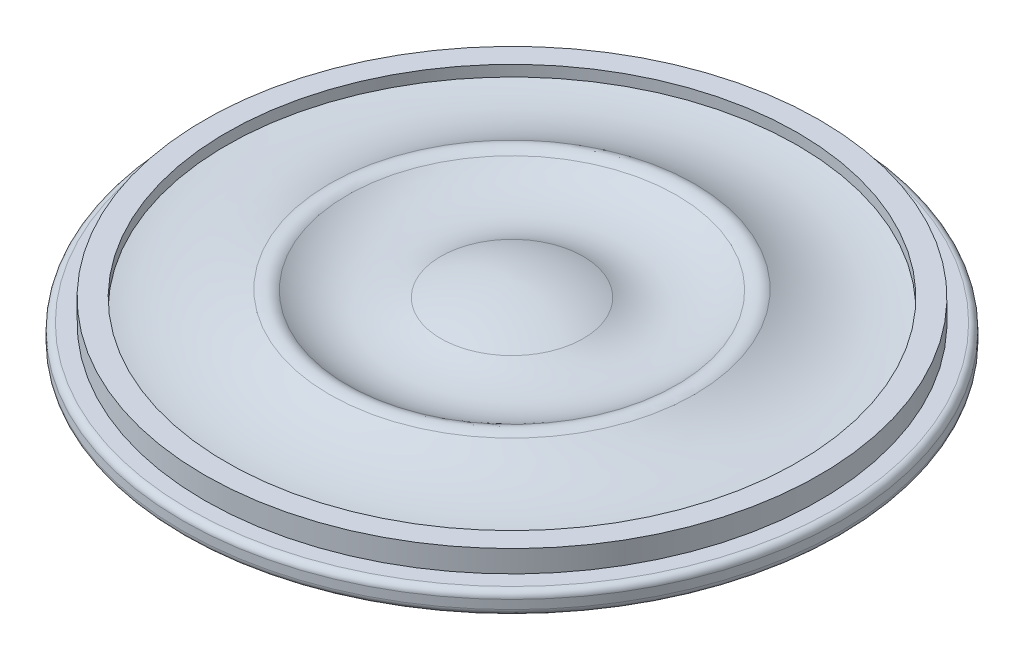
ISO-10303-21;
HEADER;
FILE_DESCRIPTION(('STEP AP214'),'2;1');
FILE_NAME('part.step','',(''),(''),'','','');
FILE_SCHEMA(('AUTOMOTIVE_DESIGN { 1 0 10303 214 1 1 1 1 }'));
ENDSEC;
DATA;
#1=APPLICATION_CONTEXT('core data for automotive mechanical design processes');
#2=APPLICATION_PROTOCOL_DEFINITION('international standard','automotive_design',2000,#1);
#3=PRODUCT_CONTEXT('',#1,'mechanical');
#4=PRODUCT('Part','Part','',(#3));
#5=PRODUCT_RELATED_PRODUCT_CATEGORY('part','',(#4));
#6=PRODUCT_DEFINITION_FORMATION('','',#4);
#7=PRODUCT_DEFINITION_CONTEXT('part definition',#1,'design');
#8=PRODUCT_DEFINITION('design','',#6,#7);
#9=PRODUCT_DEFINITION_SHAPE('','',#8);
#10=(LENGTH_UNIT() NAMED_UNIT(*) SI_UNIT(.MILLI.,.METRE.));
#11=(NAMED_UNIT(*) PLANE_ANGLE_UNIT() SI_UNIT($,.RADIAN.));
#12=(NAMED_UNIT(*) SI_UNIT($,.STERADIAN.) SOLID_ANGLE_UNIT());
#13=UNCERTAINTY_MEASURE_WITH_UNIT(LENGTH_MEASURE(1.E-05),#10,'distance_accuracy_value','');
#14=(GEOMETRIC_REPRESENTATION_CONTEXT(3) GLOBAL_UNCERTAINTY_ASSIGNED_CONTEXT((#13)) GLOBAL_UNIT_ASSIGNED_CONTEXT((#10,
#11,#12)) REPRESENTATION_CONTEXT('',''));
#15=CARTESIAN_POINT('',(0.,0.,0.));
#16=DIRECTION('',(0.,0.,1.));
#17=DIRECTION('',(1.,0.,0.));
#18=AXIS2_PLACEMENT_3D('',#15,#16,#17);
#19=CARTESIAN_POINT('',(0.,-4.37173358637806,0.261175007442525));
#20=DIRECTION('',(-1.,0.,0.));
#21=DIRECTION('',(0.,0.,-1.));
#22=AXIS2_PLACEMENT_3D('',#19,#20,#21);
#23=CIRCLE('',#22,9.07549241896727);
#24=TRIMMED_CURVE('',#23,(PARAMETER_VALUE(-1.5420142994785)),(PARAMETER_VALUE(1.5420142994785)),
.T.,.PARAMETER.);
#25=CARTESIAN_POINT('',(0.,-4.37173358637806,0.));
#26=DIRECTION('',(0.,-1.,0.));
#27=AXIS1_PLACEMENT('',#25,#26);
#28=SURFACE_OF_REVOLUTION('',#24,#27);
#29=CARTESIAN_POINT('',(0.,4.7,0.));
#30=VERTEX_POINT('',#29);
#31=VERTEX_LOOP('',#30);
#32=FACE_BOUND('',#31,.T.);
#33=CARTESIAN_POINT('',(0.,4.,0.));
#34=DIRECTION('',(0.,-1.,0.));
#35=DIRECTION('',(0.,0.,-1.));
#36=AXIS2_PLACEMENT_3D('',#33,#34,#35);
#37=CIRCLE('',#36,3.24291394768431);
#38=CARTESIAN_POINT('',(0.,4.,-3.24291394768431));
#39=VERTEX_POINT('',#38);
#40=EDGE_CURVE('E49',#39,#39,#37,.T.);
#41=ORIENTED_EDGE('',*,*,#40,.F.);
#42=EDGE_LOOP('',(#41));
#43=FACE_BOUND('',#42,.T.);
#44=ADVANCED_FACE('F35',(#32,#43),#28,.T.);
#45=CARTESIAN_POINT('',(0.,7.58416322124248,0.));
#46=DIRECTION('',(0.,-1.,0.));
#47=DIRECTION('',(0.,0.,-1.));
#48=AXIS2_PLACEMENT_3D('',#45,#46,#47);
#49=TOROIDAL_SURFACE('',#48,5.13123959711297,4.05117263947088);
#50=ORIENTED_EDGE('',*,*,#40,.T.);
#51=EDGE_LOOP('',(#50));
#52=FACE_BOUND('',#51,.T.);
#53=CARTESIAN_POINT('',(0.,4.2914001779998,0.));
#54=DIRECTION('',(0.,-1.,0.));
#55=DIRECTION('',(0.,0.,-1.));
#56=AXIS2_PLACEMENT_3D('',#53,#54,#55);
#57=CIRCLE('',#56,7.49126317662496);
#58=CARTESIAN_POINT('',(0.,4.2914001779998,-7.49126317662496));
#59=VERTEX_POINT('',#58);
#60=EDGE_CURVE('E52',#59,#59,#57,.T.);
#61=ORIENTED_EDGE('',*,*,#60,.F.);
#62=EDGE_LOOP('',(#61));
#63=FACE_BOUND('',#62,.T.);
#64=ADVANCED_FACE('F46',(#52,#63),#49,.F.);
#65=CARTESIAN_POINT('',(0.,3.67936782145066,0.));
#66=DIRECTION('',(0.,-1.,0.));
#67=DIRECTION('',(0.,0.,-1.));
#68=AXIS2_PLACEMENT_3D('',#65,#66,#67);
#69=TOROIDAL_SURFACE('',#68,7.9299254107157,0.752999442948378);
#70=ORIENTED_EDGE('',*,*,#60,.T.);
#71=EDGE_LOOP('',(#70));
#72=FACE_BOUND('',#71,.T.);
#73=CARTESIAN_POINT('',(0.,4.32927439203146,0.));
#74=DIRECTION('',(0.,-1.,0.));
#75=DIRECTION('',(0.,0.,-1.));
#76=AXIS2_PLACEMENT_3D('',#73,#74,#75);
#77=CIRCLE('',#76,8.31022740991697);
#78=CARTESIAN_POINT('',(0.,4.32927439203146,-8.31022740991697));
#79=VERTEX_POINT('',#78);
#80=EDGE_CURVE('E58',#79,#79,#77,.T.);
#81=ORIENTED_EDGE('',*,*,#80,.F.);
#82=EDGE_LOOP('',(#81));
#83=FACE_BOUND('',#82,.T.);
#84=ADVANCED_FACE('F238',(#72,#83),#69,.T.);
#85=CARTESIAN_POINT('',(0.,10.2513418570426,0.));
#86=DIRECTION('',(0.,-1.,0.));
#87=DIRECTION('',(0.,0.,-1.));
#88=AXIS2_PLACEMENT_3D('',#85,#86,#87);
#89=TOROIDAL_SURFACE('',#88,11.7756087405532,6.86146856196731);
#90=ORIENTED_EDGE('',*,*,#80,.T.);
#91=EDGE_LOOP('',(#90));
#92=FACE_BOUND('',#91,.T.);
#93=CARTESIAN_POINT('',(0.,3.5,0.));
#94=DIRECTION('',(0.,-1.,0.));
#95=DIRECTION('',(0.,0.,-1.));
#96=AXIS2_PLACEMENT_3D('',#93,#94,#95);
#97=CIRCLE('',#96,13.);
#98=CARTESIAN_POINT('',(0.,3.5,-13.));
#99=VERTEX_POINT('',#98);
#100=EDGE_CURVE('E250',#99,#99,#97,.T.);
#101=ORIENTED_EDGE('',*,*,#100,.F.);
#102=EDGE_LOOP('',(#101));
#103=FACE_BOUND('',#102,.T.);
#104=ADVANCED_FACE('F234',(#92,#103),#89,.F.);
#105=CARTESIAN_POINT('',(0.,0.,0.));
#106=DIRECTION('',(0.,-1.,0.));
#107=DIRECTION('',(0.,0.,-1.));
#108=AXIS2_PLACEMENT_3D('',#105,#106,#107);
#109=CYLINDRICAL_SURFACE('',#108,13.);
#110=ORIENTED_EDGE('',*,*,#100,.T.);
#111=EDGE_LOOP('',(#110));
#112=FACE_BOUND('',#111,.T.);
#113=CARTESIAN_POINT('',(0.,4.,0.));
#114=DIRECTION('',(0.,-1.,0.));
#115=DIRECTION('',(0.,0.,-1.));
#116=AXIS2_PLACEMENT_3D('',#113,#114,#115);
#117=CIRCLE('',#116,13.);
#118=CARTESIAN_POINT('',(0.,4.,-13.));
#119=VERTEX_POINT('',#118);
#120=EDGE_CURVE('E252',#119,#119,#117,.T.);
#121=ORIENTED_EDGE('',*,*,#120,.F.);
#122=EDGE_LOOP('',(#121));
#123=FACE_BOUND('',#122,.T.);
#124=ADVANCED_FACE('F230',(#112,#123),#109,.F.);
#125=CARTESIAN_POINT('',(14.,4.,0.));
#126=DIRECTION('',(0.,1.,0.));
#127=DIRECTION('',(0.,0.,1.));
#128=AXIS2_PLACEMENT_3D('',#125,#126,#127);
#129=PLANE('',#128);
#130=ORIENTED_EDGE('',*,*,#120,.T.);
#131=EDGE_LOOP('',(#130));
#132=FACE_BOUND('',#131,.T.);
#133=CARTESIAN_POINT('',(0.,4.,0.));
#134=DIRECTION('',(0.,-1.,0.));
#135=DIRECTION('',(0.,0.,-1.));
#136=AXIS2_PLACEMENT_3D('',#133,#134,#135);
#137=CIRCLE('',#136,14.);
#138=CARTESIAN_POINT('',(0.,4.,-14.));
#139=VERTEX_POINT('',#138);
#140=EDGE_CURVE('E257',#139,#139,#137,.T.);
#141=ORIENTED_EDGE('',*,*,#140,.F.);
#142=EDGE_LOOP('',(#141));
#143=FACE_BOUND('',#142,.T.);
#144=ADVANCED_FACE('F226',(#132,#143),#129,.T.);
#145=CARTESIAN_POINT('',(0.,0.,0.));
#146=DIRECTION('',(0.,-1.,0.));
#147=DIRECTION('',(0.,0.,-1.));
#148=AXIS2_PLACEMENT_3D('',#145,#146,#147);
#149=CYLINDRICAL_SURFACE('',#148,14.);
#150=ORIENTED_EDGE('',*,*,#140,.T.);
#151=EDGE_LOOP('',(#150));
#152=FACE_BOUND('',#151,.T.);
#153=CARTESIAN_POINT('',(0.,3.,0.));
#154=DIRECTION('',(0.,-1.,0.));
#155=DIRECTION('',(0.,0.,-1.));
#156=AXIS2_PLACEMENT_3D('',#153,#154,#155);
#157=CIRCLE('',#156,14.);
#158=CARTESIAN_POINT('',(0.,3.,-14.));
#159=VERTEX_POINT('',#158);
#160=EDGE_CURVE('E260',#159,#159,#157,.T.);
#161=ORIENTED_EDGE('',*,*,#160,.F.);
#162=EDGE_LOOP('',(#161));
#163=FACE_BOUND('',#162,.T.);
#164=ADVANCED_FACE('F222',(#152,#163),#149,.T.);
#165=CARTESIAN_POINT('',(15.,3.,0.));
#166=DIRECTION('',(0.,1.,0.));
#167=DIRECTION('',(0.,0.,1.));
#168=AXIS2_PLACEMENT_3D('',#165,#166,#167);
#169=PLANE('',#168);
#170=CARTESIAN_POINT('',(0.,3.,0.));
#171=DIRECTION('',(0.,1.,0.));
#172=DIRECTION('',(0.,0.,1.));
#173=AXIS2_PLACEMENT_3D('',#170,#171,#172);
#174=CIRCLE('',#173,14.7);
#175=CARTESIAN_POINT('',(0.,3.,14.7));
#176=VERTEX_POINT('',#175);
#177=EDGE_CURVE('E70',#176,#176,#174,.T.);
#178=ORIENTED_EDGE('',*,*,#177,.T.);
#179=EDGE_LOOP('',(#178));
#180=FACE_BOUND('',#179,.T.);
#181=ORIENTED_EDGE('',*,*,#160,.T.);
#182=EDGE_LOOP('',(#181));
#183=FACE_BOUND('',#182,.T.);
#184=ADVANCED_FACE('F218',(#180,#183),#169,.T.);
#185=CARTESIAN_POINT('',(0.,0.,0.));
#186=DIRECTION('',(0.,-1.,0.));
#187=DIRECTION('',(0.,0.,-1.));
#188=AXIS2_PLACEMENT_3D('',#185,#186,#187);
#189=CYLINDRICAL_SURFACE('',#188,15.);
#190=CARTESIAN_POINT('',(0.,2.7,0.));
#191=DIRECTION('',(0.,1.,0.));
#192=DIRECTION('',(0.,0.,1.));
#193=AXIS2_PLACEMENT_3D('',#190,#191,#192);
#194=CIRCLE('',#193,15.);
#195=CARTESIAN_POINT('',(0.,2.7,15.));
#196=VERTEX_POINT('',#195);
#197=EDGE_CURVE('E67',#196,#196,#194,.F.);
#198=ORIENTED_EDGE('',*,*,#197,.T.);
#199=EDGE_LOOP('',(#198));
#200=FACE_BOUND('',#199,.T.);
#201=CARTESIAN_POINT('',(0.,2.3,0.));
#202=DIRECTION('',(0.,-1.,0.));
#203=DIRECTION('',(0.,0.,-1.));
#204=AXIS2_PLACEMENT_3D('',#201,#202,#203);
#205=CIRCLE('',#204,15.);
#206=CARTESIAN_POINT('',(0.,2.3,-15.));
#207=VERTEX_POINT('',#206);
#208=EDGE_CURVE('E64',#207,#207,#205,.F.);
#209=ORIENTED_EDGE('',*,*,#208,.T.);
#210=EDGE_LOOP('',(#209));
#211=FACE_BOUND('',#210,.T.);
#212=ADVANCED_FACE('F214',(#200,#211),#189,.T.);
#213=CARTESIAN_POINT('',(13.,2.,0.));
#214=DIRECTION('',(0.,-1.,0.));
#215=DIRECTION('',(0.,0.,-1.));
#216=AXIS2_PLACEMENT_3D('',#213,#214,#215);
#217=PLANE('',#216);
#218=CARTESIAN_POINT('',(0.,2.,0.));
#219=DIRECTION('',(0.,-1.,0.));
#220=DIRECTION('',(0.,0.,-1.));
#221=AXIS2_PLACEMENT_3D('',#218,#219,#220);
#222=CIRCLE('',#221,14.7);
#223=CARTESIAN_POINT('',(0.,2.,-14.7));
#224=VERTEX_POINT('',#223);
#225=EDGE_CURVE('E73',#224,#224,#222,.T.);
#226=ORIENTED_EDGE('',*,*,#225,.T.);
#227=EDGE_LOOP('',(#226));
#228=FACE_BOUND('',#227,.T.);
#229=CARTESIAN_POINT('',(0.,2.,0.));
#230=DIRECTION('',(0.,-1.,0.));
#231=DIRECTION('',(0.,0.,-1.));
#232=AXIS2_PLACEMENT_3D('',#229,#230,#231);
#233=CIRCLE('',#232,13.);
#234=CARTESIAN_POINT('',(0.,2.,-13.));
#235=VERTEX_POINT('',#234);
#236=EDGE_CURVE('E263',#235,#235,#233,.T.);
#237=ORIENTED_EDGE('',*,*,#236,.F.);
#238=EDGE_LOOP('',(#237));
#239=FACE_BOUND('',#238,.T.);
#240=ADVANCED_FACE('F210',(#228,#239),#217,.T.);
#241=CARTESIAN_POINT('',(0.,0.,0.));
#242=DIRECTION('',(0.,-1.,0.));
#243=DIRECTION('',(0.,0.,-1.));
#244=AXIS2_PLACEMENT_3D('',#241,#242,#243);
#245=CYLINDRICAL_SURFACE('',#244,13.);
#246=CARTESIAN_POINT('',(0.,1.8,0.));
#247=DIRECTION('',(0.,-1.,0.));
#248=DIRECTION('',(0.,0.,-1.));
#249=AXIS2_PLACEMENT_3D('',#246,#247,#248);
#250=CIRCLE('',#249,13.);
#251=CARTESIAN_POINT('',(0.,1.8,-13.));
#252=VERTEX_POINT('',#251);
#253=EDGE_CURVE('E11',#252,#252,#250,.F.);
#254=ORIENTED_EDGE('',*,*,#253,.T.);
#255=EDGE_LOOP('',(#254));
#256=FACE_BOUND('',#255,.T.);
#257=ORIENTED_EDGE('',*,*,#236,.T.);
#258=EDGE_LOOP('',(#257));
#259=FACE_BOUND('',#258,.T.);
#260=ADVANCED_FACE('F207',(#256,#259),#245,.T.);
#261=CARTESIAN_POINT('',(8.,1.5,0.));
#262=DIRECTION('',(0.,-1.,0.));
#263=DIRECTION('',(0.,0.,-1.));
#264=AXIS2_PLACEMENT_3D('',#261,#262,#263);
#265=PLANE('',#264);
#266=CARTESIAN_POINT('',(0.,1.5,0.));
#267=DIRECTION('',(0.,-1.,0.));
#268=DIRECTION('',(0.,0.,-1.));
#269=AXIS2_PLACEMENT_3D('',#266,#267,#268);
#270=CIRCLE('',#269,12.7);
#271=CARTESIAN_POINT('',(0.,1.5,-12.7));
#272=VERTEX_POINT('',#271);
#273=EDGE_CURVE('E41',#272,#272,#270,.T.);
#274=ORIENTED_EDGE('',*,*,#273,.T.);
#275=EDGE_LOOP('',(#274));
#276=FACE_BOUND('',#275,.T.);
#277=CARTESIAN_POINT('',(-9.00896263988139,1.5,5.75057930904377));
#278=DIRECTION('',(0.,-1.,0.));
#279=DIRECTION('',(0.499999999999989,0.,-0.866025403784445));
#280=AXIS2_PLACEMENT_3D('',#277,#278,#279);
#281=CIRCLE('',#280,1.26698993207958);
#282=CARTESIAN_POINT('',(-8.37546767384162,1.5,4.65333384152372));
#283=VERTEX_POINT('',#282);
#284=EDGE_CURVE('E338',#283,#283,#281,.T.);
#285=ORIENTED_EDGE('',*,*,#284,.F.);
#286=EDGE_LOOP('',(#285));
#287=FACE_BOUND('',#286,.T.);
#288=CARTESIAN_POINT('',(-10.6772801624041,1.5,0.475666448168358));
#289=DIRECTION('',(0.,-1.,0.));
#290=DIRECTION('',(0.866025403784433,0.,-0.50000000000001));
#291=AXIS2_PLACEMENT_3D('',#288,#289,#290);
#292=CIRCLE('',#291,1.26698993207958);
#293=CARTESIAN_POINT('',(-9.58003469488406,1.5,-0.157828517871444));
#294=VERTEX_POINT('',#293);
#295=EDGE_CURVE('E332',#294,#294,#292,.T.);
#296=ORIENTED_EDGE('',*,*,#295,.F.);
#297=EDGE_LOOP('',(#296));
#298=FACE_BOUND('',#297,.T.);
#299=CARTESIAN_POINT('',(-9.48462908804975,1.5,-4.92670085336034));
#300=DIRECTION('',(0.,-1.,0.));
#301=DIRECTION('',(1.,0.,0.));
#302=AXIS2_PLACEMENT_3D('',#299,#300,#301);
#303=CIRCLE('',#302,1.26698993207958);
#304=CARTESIAN_POINT('',(-8.21763915597018,1.5,-4.92670085336036));
#305=VERTEX_POINT('',#304);
#306=EDGE_CURVE('E326',#305,#305,#303,.T.);
#307=ORIENTED_EDGE('',*,*,#306,.F.);
#308=EDGE_LOOP('',(#307));
#309=FACE_BOUND('',#308,.T.);
#310=CARTESIAN_POINT('',(-5.75057930904374,1.5,-9.00896263988141));
#311=DIRECTION('',(0.,-1.,0.));
#312=DIRECTION('',(0.866025403784443,0.,0.499999999999992));
#313=AXIS2_PLACEMENT_3D('',#310,#311,#312);
#314=CIRCLE('',#313,1.26698993207958);
#315=CARTESIAN_POINT('',(-4.6533338415237,1.5,-8.37546767384164));
#316=VERTEX_POINT('',#315);
#317=EDGE_CURVE('E320',#316,#316,#314,.T.);
#318=ORIENTED_EDGE('',*,*,#317,.F.);
#319=EDGE_LOOP('',(#318));
#320=FACE_BOUND('',#319,.T.);
#321=CARTESIAN_POINT('',(-0.475666448168321,1.5,-10.6772801624041));
#322=DIRECTION('',(0.,-1.,0.));
#323=DIRECTION('',(0.500000000000007,0.,0.866025403784435));
#324=AXIS2_PLACEMENT_3D('',#321,#322,#323);
#325=CIRCLE('',#324,1.26698993207958);
#326=CARTESIAN_POINT('',(0.157828517871476,1.5,-9.58003469488406));
#327=VERTEX_POINT('',#326);
#328=EDGE_CURVE('E314',#327,#327,#325,.T.);
#329=ORIENTED_EDGE('',*,*,#328,.F.);
#330=EDGE_LOOP('',(#329));
#331=FACE_BOUND('',#330,.T.);
#332=CARTESIAN_POINT('',(4.92670085336038,1.5,-9.48462908804974));
#333=DIRECTION('',(0.,-1.,0.));
#334=DIRECTION('',(0.,0.,1.));
#335=AXIS2_PLACEMENT_3D('',#332,#333,#334);
#336=CIRCLE('',#335,1.26698993207958);
#337=CARTESIAN_POINT('',(4.92670085336039,1.5,-8.21763915597016));
#338=VERTEX_POINT('',#337);
#339=EDGE_CURVE('E308',#338,#338,#336,.T.);
#340=ORIENTED_EDGE('',*,*,#339,.F.);
#341=EDGE_LOOP('',(#340));
#342=FACE_BOUND('',#341,.T.);
#343=CARTESIAN_POINT('',(9.00896263988144,1.5,-5.7505793090437));
#344=DIRECTION('',(0.,-1.,0.));
#345=DIRECTION('',(-0.499999999999995,0.,0.866025403784442));
#346=AXIS2_PLACEMENT_3D('',#343,#344,#345);
#347=CIRCLE('',#346,1.26698993207958);
#348=CARTESIAN_POINT('',(8.37546767384165,1.5,-4.65333384152367));
#349=VERTEX_POINT('',#348);
#350=EDGE_CURVE('E302',#349,#349,#347,.T.);
#351=ORIENTED_EDGE('',*,*,#350,.F.);
#352=EDGE_LOOP('',(#351));
#353=FACE_BOUND('',#352,.T.);
#354=CARTESIAN_POINT('',(10.6772801624041,1.5,-0.475666448168283));
#355=DIRECTION('',(0.,-1.,0.));
#356=DIRECTION('',(-0.866025403784436,0.,0.500000000000004));
#357=AXIS2_PLACEMENT_3D('',#354,#355,#356);
#358=CIRCLE('',#357,1.26698993207958);
#359=CARTESIAN_POINT('',(9.58003469488406,1.5,0.157828517871511));
#360=VERTEX_POINT('',#359);
#361=EDGE_CURVE('E296',#360,#360,#358,.T.);
#362=ORIENTED_EDGE('',*,*,#361,.F.);
#363=EDGE_LOOP('',(#362));
#364=FACE_BOUND('',#363,.T.);
#365=CARTESIAN_POINT('',(9.48462908804972,1.5,4.92670085336041));
#366=DIRECTION('',(0.,-1.,0.));
#367=DIRECTION('',(-1.,0.,0.));
#368=AXIS2_PLACEMENT_3D('',#365,#366,#367);
#369=CIRCLE('',#368,1.26698993207958);
#370=CARTESIAN_POINT('',(8.21763915597014,1.5,4.92670085336042));
#371=VERTEX_POINT('',#370);
#372=EDGE_CURVE('E290',#371,#371,#369,.T.);
#373=ORIENTED_EDGE('',*,*,#372,.F.);
#374=EDGE_LOOP('',(#373));
#375=FACE_BOUND('',#374,.T.);
#376=CARTESIAN_POINT('',(5.75057930904367,1.5,9.00896263988145));
#377=DIRECTION('',(0.,-1.,0.));
#378=DIRECTION('',(-0.86602540378444,0.,-0.499999999999998));
#379=AXIS2_PLACEMENT_3D('',#376,#377,#378);
#380=CIRCLE('',#379,1.26698993207958);
#381=CARTESIAN_POINT('',(4.65333384152364,1.5,8.37546767384167));
#382=VERTEX_POINT('',#381);
#383=EDGE_CURVE('E284',#382,#382,#380,.T.);
#384=ORIENTED_EDGE('',*,*,#383,.F.);
#385=EDGE_LOOP('',(#384));
#386=FACE_BOUND('',#385,.T.);
#387=CARTESIAN_POINT('',(0.475666448168246,1.5,10.6772801624041));
#388=DIRECTION('',(0.,-1.,0.));
#389=DIRECTION('',(-0.500000000000001,0.,-0.866025403784438));
#390=AXIS2_PLACEMENT_3D('',#387,#388,#389);
#391=CIRCLE('',#390,1.26698993207958);
#392=CARTESIAN_POINT('',(-0.157828517871544,1.5,9.58003469488406));
#393=VERTEX_POINT('',#392);
#394=EDGE_CURVE('E278',#393,#393,#391,.T.);
#395=ORIENTED_EDGE('',*,*,#394,.F.);
#396=EDGE_LOOP('',(#395));
#397=FACE_BOUND('',#396,.T.);
#398=CARTESIAN_POINT('',(-4.92670085336044,1.5,9.4846290880497));
#399=DIRECTION('',(0.,-1.,0.));
#400=DIRECTION('',(0.,0.,-1.));
#401=AXIS2_PLACEMENT_3D('',#398,#399,#400);
#402=CIRCLE('',#401,1.26698993207958);
#403=CARTESIAN_POINT('',(-4.92670085336044,1.5,8.21763915597012));
#404=VERTEX_POINT('',#403);
#405=EDGE_CURVE('E272',#404,#404,#402,.T.);
#406=ORIENTED_EDGE('',*,*,#405,.F.);
#407=EDGE_LOOP('',(#406));
#408=FACE_BOUND('',#407,.T.);
#409=CARTESIAN_POINT('',(0.,1.5,0.));
#410=DIRECTION('',(0.,-1.,0.));
#411=DIRECTION('',(0.,0.,-1.));
#412=AXIS2_PLACEMENT_3D('',#409,#410,#411);
#413=CIRCLE('',#412,8.);
#414=CARTESIAN_POINT('',(0.,1.5,-8.));
#415=VERTEX_POINT('',#414);
#416=EDGE_CURVE('E266',#415,#415,#413,.T.);
#417=ORIENTED_EDGE('',*,*,#416,.F.);
#418=EDGE_LOOP('',(#417));
#419=FACE_BOUND('',#418,.T.);
#420=ADVANCED_FACE('F78',(#276,#287,#298,#309,#320,#331,#342,#353,#364,#375,#386,#397,#408,
#419),#265,.T.);
#421=CARTESIAN_POINT('',(0.,0.,0.));
#422=DIRECTION('',(0.,-1.,0.));
#423=DIRECTION('',(0.,0.,-1.));
#424=AXIS2_PLACEMENT_3D('',#421,#422,#423);
#425=CYLINDRICAL_SURFACE('',#424,8.);
#426=CARTESIAN_POINT('',(0.,0.3,0.));
#427=DIRECTION('',(0.,-1.,0.));
#428=DIRECTION('',(0.,0.,-1.));
#429=AXIS2_PLACEMENT_3D('',#426,#427,#428);
#430=CIRCLE('',#429,8.);
#431=CARTESIAN_POINT('',(0.,0.3,-8.));
#432=VERTEX_POINT('',#431);
#433=EDGE_CURVE('E55',#432,#432,#430,.F.);
#434=ORIENTED_EDGE('',*,*,#433,.T.);
#435=EDGE_LOOP('',(#434));
#436=FACE_BOUND('',#435,.T.);
#437=ORIENTED_EDGE('',*,*,#416,.T.);
#438=EDGE_LOOP('',(#437));
#439=FACE_BOUND('',#438,.T.);
#440=ADVANCED_FACE('F200',(#436,#439),#425,.T.);
#441=CARTESIAN_POINT('',(0.,0.,0.));
#442=DIRECTION('',(0.,-1.,0.));
#443=DIRECTION('',(0.,0.,-1.));
#444=AXIS2_PLACEMENT_3D('',#441,#442,#443);
#445=PLANE('',#444);
#446=CARTESIAN_POINT('',(0.,0.,0.));
#447=DIRECTION('',(0.,-1.,0.));
#448=DIRECTION('',(0.,0.,-1.));
#449=AXIS2_PLACEMENT_3D('',#446,#447,#448);
#450=CIRCLE('',#449,7.7);
#451=CARTESIAN_POINT('',(0.,0.,-7.7));
#452=VERTEX_POINT('',#451);
#453=EDGE_CURVE('E51',#452,#452,#450,.T.);
#454=ORIENTED_EDGE('',*,*,#453,.T.);
#455=EDGE_LOOP('',(#454));
#456=FACE_BOUND('',#455,.T.);
#457=ADVANCED_FACE('F196',(#456),#445,.T.);
#458=CARTESIAN_POINT('',(-4.92670085336044,2.5,9.4846290880497));
#459=DIRECTION('',(0.,-1.,0.));
#460=DIRECTION('',(0.,0.,-1.));
#461=AXIS2_PLACEMENT_3D('',#458,#459,#460);
#462=CYLINDRICAL_SURFACE('',#461,1.26698993207958);
#463=CARTESIAN_POINT('',(-4.92670085336044,2.5,9.4846290880497));
#464=DIRECTION('',(0.,-1.,0.));
#465=DIRECTION('',(0.,0.,-1.));
#466=AXIS2_PLACEMENT_3D('',#463,#464,#465);
#467=CIRCLE('',#466,1.26698993207958);
#468=CARTESIAN_POINT('',(-4.92670085336044,2.5,8.21763915597012));
#469=VERTEX_POINT('',#468);
#470=EDGE_CURVE('E269',#469,#469,#467,.T.);
#471=ORIENTED_EDGE('',*,*,#470,.F.);
#472=EDGE_LOOP('',(#471));
#473=FACE_BOUND('',#472,.T.);
#474=ORIENTED_EDGE('',*,*,#405,.T.);
#475=EDGE_LOOP('',(#474));
#476=FACE_BOUND('',#475,.T.);
#477=ADVANCED_FACE('F192',(#473,#476),#462,.F.);
#478=CARTESIAN_POINT('',(-4.92670085336044,2.5,9.4846290880497));
#479=DIRECTION('',(0.,-1.,0.));
#480=DIRECTION('',(0.,0.,-1.));
#481=AXIS2_PLACEMENT_3D('',#478,#479,#480);
#482=PLANE('',#481);
#483=ORIENTED_EDGE('',*,*,#470,.T.);
#484=EDGE_LOOP('',(#483));
#485=FACE_BOUND('',#484,.T.);
#486=ADVANCED_FACE('F188',(#485),#482,.T.);
#487=CARTESIAN_POINT('',(0.475666448168246,2.5,10.6772801624041));
#488=DIRECTION('',(0.,-1.,0.));
#489=DIRECTION('',(0.,0.,-1.));
#490=AXIS2_PLACEMENT_3D('',#487,#488,#489);
#491=CYLINDRICAL_SURFACE('',#490,1.26698993207958);
#492=CARTESIAN_POINT('',(0.475666448168246,2.5,10.6772801624041));
#493=DIRECTION('',(0.,-1.,0.));
#494=DIRECTION('',(-0.500000000000001,0.,-0.866025403784438));
#495=AXIS2_PLACEMENT_3D('',#492,#493,#494);
#496=CIRCLE('',#495,1.26698993207958);
#497=CARTESIAN_POINT('',(-0.157828517871544,2.5,9.58003469488406));
#498=VERTEX_POINT('',#497);
#499=EDGE_CURVE('E275',#498,#498,#496,.T.);
#500=ORIENTED_EDGE('',*,*,#499,.F.);
#501=EDGE_LOOP('',(#500));
#502=FACE_BOUND('',#501,.T.);
#503=ORIENTED_EDGE('',*,*,#394,.T.);
#504=EDGE_LOOP('',(#503));
#505=FACE_BOUND('',#504,.T.);
#506=ADVANCED_FACE('F184',(#502,#505),#491,.F.);
#507=CARTESIAN_POINT('',(0.475666448168246,2.5,10.6772801624041));
#508=DIRECTION('',(0.,-1.,0.));
#509=DIRECTION('',(-0.500000000000001,0.,-0.866025403784438));
#510=AXIS2_PLACEMENT_3D('',#507,#508,#509);
#511=PLANE('',#510);
#512=ORIENTED_EDGE('',*,*,#499,.T.);
#513=EDGE_LOOP('',(#512));
#514=FACE_BOUND('',#513,.T.);
#515=ADVANCED_FACE('F180',(#514),#511,.T.);
#516=CARTESIAN_POINT('',(5.75057930904367,2.5,9.00896263988145));
#517=DIRECTION('',(0.,-1.,0.));
#518=DIRECTION('',(0.,0.,-1.));
#519=AXIS2_PLACEMENT_3D('',#516,#517,#518);
#520=CYLINDRICAL_SURFACE('',#519,1.26698993207958);
#521=CARTESIAN_POINT('',(5.75057930904367,2.5,9.00896263988145));
#522=DIRECTION('',(0.,-1.,0.));
#523=DIRECTION('',(-0.86602540378444,0.,-0.499999999999998));
#524=AXIS2_PLACEMENT_3D('',#521,#522,#523);
#525=CIRCLE('',#524,1.26698993207958);
#526=CARTESIAN_POINT('',(4.65333384152364,2.5,8.37546767384167));
#527=VERTEX_POINT('',#526);
#528=EDGE_CURVE('E281',#527,#527,#525,.T.);
#529=ORIENTED_EDGE('',*,*,#528,.F.);
#530=EDGE_LOOP('',(#529));
#531=FACE_BOUND('',#530,.T.);
#532=ORIENTED_EDGE('',*,*,#383,.T.);
#533=EDGE_LOOP('',(#532));
#534=FACE_BOUND('',#533,.T.);
#535=ADVANCED_FACE('F176',(#531,#534),#520,.F.);
#536=CARTESIAN_POINT('',(5.75057930904367,2.5,9.00896263988145));
#537=DIRECTION('',(0.,-1.,0.));
#538=DIRECTION('',(-0.86602540378444,0.,-0.499999999999998));
#539=AXIS2_PLACEMENT_3D('',#536,#537,#538);
#540=PLANE('',#539);
#541=ORIENTED_EDGE('',*,*,#528,.T.);
#542=EDGE_LOOP('',(#541));
#543=FACE_BOUND('',#542,.T.);
#544=ADVANCED_FACE('F172',(#543),#540,.T.);
#545=CARTESIAN_POINT('',(9.48462908804972,2.5,4.92670085336041));
#546=DIRECTION('',(0.,-1.,0.));
#547=DIRECTION('',(0.,0.,-1.));
#548=AXIS2_PLACEMENT_3D('',#545,#546,#547);
#549=CYLINDRICAL_SURFACE('',#548,1.26698993207958);
#550=CARTESIAN_POINT('',(9.48462908804972,2.5,4.92670085336041));
#551=DIRECTION('',(0.,-1.,0.));
#552=DIRECTION('',(-1.,0.,0.));
#553=AXIS2_PLACEMENT_3D('',#550,#551,#552);
#554=CIRCLE('',#553,1.26698993207958);
#555=CARTESIAN_POINT('',(8.21763915597014,2.5,4.92670085336042));
#556=VERTEX_POINT('',#555);
#557=EDGE_CURVE('E287',#556,#556,#554,.T.);
#558=ORIENTED_EDGE('',*,*,#557,.F.);
#559=EDGE_LOOP('',(#558));
#560=FACE_BOUND('',#559,.T.);
#561=ORIENTED_EDGE('',*,*,#372,.T.);
#562=EDGE_LOOP('',(#561));
#563=FACE_BOUND('',#562,.T.);
#564=ADVANCED_FACE('F168',(#560,#563),#549,.F.);
#565=CARTESIAN_POINT('',(9.48462908804972,2.5,4.92670085336041));
#566=DIRECTION('',(0.,-1.,0.));
#567=DIRECTION('',(-1.,0.,0.));
#568=AXIS2_PLACEMENT_3D('',#565,#566,#567);
#569=PLANE('',#568);
#570=ORIENTED_EDGE('',*,*,#557,.T.);
#571=EDGE_LOOP('',(#570));
#572=FACE_BOUND('',#571,.T.);
#573=ADVANCED_FACE('F164',(#572),#569,.T.);
#574=CARTESIAN_POINT('',(10.6772801624041,2.5,-0.475666448168283));
#575=DIRECTION('',(0.,-1.,0.));
#576=DIRECTION('',(0.,0.,-1.));
#577=AXIS2_PLACEMENT_3D('',#574,#575,#576);
#578=CYLINDRICAL_SURFACE('',#577,1.26698993207958);
#579=CARTESIAN_POINT('',(10.6772801624041,2.5,-0.475666448168283));
#580=DIRECTION('',(0.,-1.,0.));
#581=DIRECTION('',(-0.866025403784436,0.,0.500000000000004));
#582=AXIS2_PLACEMENT_3D('',#579,#580,#581);
#583=CIRCLE('',#582,1.26698993207958);
#584=CARTESIAN_POINT('',(9.58003469488406,2.5,0.157828517871511));
#585=VERTEX_POINT('',#584);
#586=EDGE_CURVE('E293',#585,#585,#583,.T.);
#587=ORIENTED_EDGE('',*,*,#586,.F.);
#588=EDGE_LOOP('',(#587));
#589=FACE_BOUND('',#588,.T.);
#590=ORIENTED_EDGE('',*,*,#361,.T.);
#591=EDGE_LOOP('',(#590));
#592=FACE_BOUND('',#591,.T.);
#593=ADVANCED_FACE('F160',(#589,#592),#578,.F.);
#594=CARTESIAN_POINT('',(10.6772801624041,2.5,-0.475666448168283));
#595=DIRECTION('',(0.,-1.,0.));
#596=DIRECTION('',(-0.866025403784436,0.,0.500000000000004));
#597=AXIS2_PLACEMENT_3D('',#594,#595,#596);
#598=PLANE('',#597);
#599=ORIENTED_EDGE('',*,*,#586,.T.);
#600=EDGE_LOOP('',(#599));
#601=FACE_BOUND('',#600,.T.);
#602=ADVANCED_FACE('F156',(#601),#598,.T.);
#603=CARTESIAN_POINT('',(9.00896263988144,2.5,-5.7505793090437));
#604=DIRECTION('',(0.,-1.,0.));
#605=DIRECTION('',(0.,0.,-1.));
#606=AXIS2_PLACEMENT_3D('',#603,#604,#605);
#607=CYLINDRICAL_SURFACE('',#606,1.26698993207958);
#608=CARTESIAN_POINT('',(9.00896263988144,2.5,-5.7505793090437));
#609=DIRECTION('',(0.,-1.,0.));
#610=DIRECTION('',(-0.499999999999995,0.,0.866025403784442));
#611=AXIS2_PLACEMENT_3D('',#608,#609,#610);
#612=CIRCLE('',#611,1.26698993207958);
#613=CARTESIAN_POINT('',(8.37546767384165,2.5,-4.65333384152367));
#614=VERTEX_POINT('',#613);
#615=EDGE_CURVE('E299',#614,#614,#612,.T.);
#616=ORIENTED_EDGE('',*,*,#615,.F.);
#617=EDGE_LOOP('',(#616));
#618=FACE_BOUND('',#617,.T.);
#619=ORIENTED_EDGE('',*,*,#350,.T.);
#620=EDGE_LOOP('',(#619));
#621=FACE_BOUND('',#620,.T.);
#622=ADVANCED_FACE('F152',(#618,#621),#607,.F.);
#623=CARTESIAN_POINT('',(9.00896263988144,2.5,-5.7505793090437));
#624=DIRECTION('',(0.,-1.,0.));
#625=DIRECTION('',(-0.499999999999995,0.,0.866025403784442));
#626=AXIS2_PLACEMENT_3D('',#623,#624,#625);
#627=PLANE('',#626);
#628=ORIENTED_EDGE('',*,*,#615,.T.);
#629=EDGE_LOOP('',(#628));
#630=FACE_BOUND('',#629,.T.);
#631=ADVANCED_FACE('F148',(#630),#627,.T.);
#632=CARTESIAN_POINT('',(4.92670085336038,2.5,-9.48462908804974));
#633=DIRECTION('',(0.,-1.,0.));
#634=DIRECTION('',(0.,0.,-1.));
#635=AXIS2_PLACEMENT_3D('',#632,#633,#634);
#636=CYLINDRICAL_SURFACE('',#635,1.26698993207958);
#637=CARTESIAN_POINT('',(4.92670085336038,2.5,-9.48462908804974));
#638=DIRECTION('',(0.,-1.,0.));
#639=DIRECTION('',(0.,0.,1.));
#640=AXIS2_PLACEMENT_3D('',#637,#638,#639);
#641=CIRCLE('',#640,1.26698993207958);
#642=CARTESIAN_POINT('',(4.92670085336039,2.5,-8.21763915597016));
#643=VERTEX_POINT('',#642);
#644=EDGE_CURVE('E305',#643,#643,#641,.T.);
#645=ORIENTED_EDGE('',*,*,#644,.F.);
#646=EDGE_LOOP('',(#645));
#647=FACE_BOUND('',#646,.T.);
#648=ORIENTED_EDGE('',*,*,#339,.T.);
#649=EDGE_LOOP('',(#648));
#650=FACE_BOUND('',#649,.T.);
#651=ADVANCED_FACE('F144',(#647,#650),#636,.F.);
#652=CARTESIAN_POINT('',(4.92670085336038,2.5,-9.48462908804974));
#653=DIRECTION('',(0.,-1.,0.));
#654=DIRECTION('',(0.,0.,1.));
#655=AXIS2_PLACEMENT_3D('',#652,#653,#654);
#656=PLANE('',#655);
#657=ORIENTED_EDGE('',*,*,#644,.T.);
#658=EDGE_LOOP('',(#657));
#659=FACE_BOUND('',#658,.T.);
#660=ADVANCED_FACE('F140',(#659),#656,.T.);
#661=CARTESIAN_POINT('',(-0.475666448168321,2.5,-10.6772801624041));
#662=DIRECTION('',(0.,-1.,0.));
#663=DIRECTION('',(0.,0.,-1.));
#664=AXIS2_PLACEMENT_3D('',#661,#662,#663);
#665=CYLINDRICAL_SURFACE('',#664,1.26698993207958);
#666=CARTESIAN_POINT('',(-0.475666448168321,2.5,-10.6772801624041));
#667=DIRECTION('',(0.,-1.,0.));
#668=DIRECTION('',(0.500000000000007,0.,0.866025403784435));
#669=AXIS2_PLACEMENT_3D('',#666,#667,#668);
#670=CIRCLE('',#669,1.26698993207958);
#671=CARTESIAN_POINT('',(0.157828517871476,2.5,-9.58003469488406));
#672=VERTEX_POINT('',#671);
#673=EDGE_CURVE('E311',#672,#672,#670,.T.);
#674=ORIENTED_EDGE('',*,*,#673,.F.);
#675=EDGE_LOOP('',(#674));
#676=FACE_BOUND('',#675,.T.);
#677=ORIENTED_EDGE('',*,*,#328,.T.);
#678=EDGE_LOOP('',(#677));
#679=FACE_BOUND('',#678,.T.);
#680=ADVANCED_FACE('F136',(#676,#679),#665,.F.);
#681=CARTESIAN_POINT('',(-0.475666448168321,2.5,-10.6772801624041));
#682=DIRECTION('',(0.,-1.,0.));
#683=DIRECTION('',(0.500000000000007,0.,0.866025403784435));
#684=AXIS2_PLACEMENT_3D('',#681,#682,#683);
#685=PLANE('',#684);
#686=ORIENTED_EDGE('',*,*,#673,.T.);
#687=EDGE_LOOP('',(#686));
#688=FACE_BOUND('',#687,.T.);
#689=ADVANCED_FACE('F132',(#688),#685,.T.);
#690=CARTESIAN_POINT('',(-5.75057930904374,2.5,-9.00896263988141));
#691=DIRECTION('',(0.,-1.,0.));
#692=DIRECTION('',(0.,0.,-1.));
#693=AXIS2_PLACEMENT_3D('',#690,#691,#692);
#694=CYLINDRICAL_SURFACE('',#693,1.26698993207958);
#695=CARTESIAN_POINT('',(-5.75057930904374,2.5,-9.00896263988141));
#696=DIRECTION('',(0.,-1.,0.));
#697=DIRECTION('',(0.866025403784443,0.,0.499999999999992));
#698=AXIS2_PLACEMENT_3D('',#695,#696,#697);
#699=CIRCLE('',#698,1.26698993207958);
#700=CARTESIAN_POINT('',(-4.6533338415237,2.5,-8.37546767384164));
#701=VERTEX_POINT('',#700);
#702=EDGE_CURVE('E317',#701,#701,#699,.T.);
#703=ORIENTED_EDGE('',*,*,#702,.F.);
#704=EDGE_LOOP('',(#703));
#705=FACE_BOUND('',#704,.T.);
#706=ORIENTED_EDGE('',*,*,#317,.T.);
#707=EDGE_LOOP('',(#706));
#708=FACE_BOUND('',#707,.T.);
#709=ADVANCED_FACE('F128',(#705,#708),#694,.F.);
#710=CARTESIAN_POINT('',(-5.75057930904374,2.5,-9.00896263988141));
#711=DIRECTION('',(0.,-1.,0.));
#712=DIRECTION('',(0.866025403784443,0.,0.499999999999992));
#713=AXIS2_PLACEMENT_3D('',#710,#711,#712);
#714=PLANE('',#713);
#715=ORIENTED_EDGE('',*,*,#702,.T.);
#716=EDGE_LOOP('',(#715));
#717=FACE_BOUND('',#716,.T.);
#718=ADVANCED_FACE('F124',(#717),#714,.T.);
#719=CARTESIAN_POINT('',(-9.48462908804975,2.5,-4.92670085336034));
#720=DIRECTION('',(0.,-1.,0.));
#721=DIRECTION('',(0.,0.,-1.));
#722=AXIS2_PLACEMENT_3D('',#719,#720,#721);
#723=CYLINDRICAL_SURFACE('',#722,1.26698993207958);
#724=CARTESIAN_POINT('',(-9.48462908804975,2.5,-4.92670085336034));
#725=DIRECTION('',(0.,-1.,0.));
#726=DIRECTION('',(1.,0.,0.));
#727=AXIS2_PLACEMENT_3D('',#724,#725,#726);
#728=CIRCLE('',#727,1.26698993207958);
#729=CARTESIAN_POINT('',(-8.21763915597018,2.5,-4.92670085336036));
#730=VERTEX_POINT('',#729);
#731=EDGE_CURVE('E323',#730,#730,#728,.T.);
#732=ORIENTED_EDGE('',*,*,#731,.F.);
#733=EDGE_LOOP('',(#732));
#734=FACE_BOUND('',#733,.T.);
#735=ORIENTED_EDGE('',*,*,#306,.T.);
#736=EDGE_LOOP('',(#735));
#737=FACE_BOUND('',#736,.T.);
#738=ADVANCED_FACE('F120',(#734,#737),#723,.F.);
#739=CARTESIAN_POINT('',(-9.48462908804975,2.5,-4.92670085336034));
#740=DIRECTION('',(0.,-1.,0.));
#741=DIRECTION('',(1.,0.,0.));
#742=AXIS2_PLACEMENT_3D('',#739,#740,#741);
#743=PLANE('',#742);
#744=ORIENTED_EDGE('',*,*,#731,.T.);
#745=EDGE_LOOP('',(#744));
#746=FACE_BOUND('',#745,.T.);
#747=ADVANCED_FACE('F116',(#746),#743,.T.);
#748=CARTESIAN_POINT('',(-10.6772801624041,2.5,0.475666448168358));
#749=DIRECTION('',(0.,-1.,0.));
#750=DIRECTION('',(0.,0.,-1.));
#751=AXIS2_PLACEMENT_3D('',#748,#749,#750);
#752=CYLINDRICAL_SURFACE('',#751,1.26698993207958);
#753=CARTESIAN_POINT('',(-10.6772801624041,2.5,0.475666448168358));
#754=DIRECTION('',(0.,-1.,0.));
#755=DIRECTION('',(0.866025403784433,0.,-0.50000000000001));
#756=AXIS2_PLACEMENT_3D('',#753,#754,#755);
#757=CIRCLE('',#756,1.26698993207958);
#758=CARTESIAN_POINT('',(-9.58003469488406,2.5,-0.157828517871444));
#759=VERTEX_POINT('',#758);
#760=EDGE_CURVE('E329',#759,#759,#757,.T.);
#761=ORIENTED_EDGE('',*,*,#760,.F.);
#762=EDGE_LOOP('',(#761));
#763=FACE_BOUND('',#762,.T.);
#764=ORIENTED_EDGE('',*,*,#295,.T.);
#765=EDGE_LOOP('',(#764));
#766=FACE_BOUND('',#765,.T.);
#767=ADVANCED_FACE('F112',(#763,#766),#752,.F.);
#768=CARTESIAN_POINT('',(-10.6772801624041,2.5,0.475666448168358));
#769=DIRECTION('',(0.,-1.,0.));
#770=DIRECTION('',(0.866025403784433,0.,-0.50000000000001));
#771=AXIS2_PLACEMENT_3D('',#768,#769,#770);
#772=PLANE('',#771);
#773=ORIENTED_EDGE('',*,*,#760,.T.);
#774=EDGE_LOOP('',(#773));
#775=FACE_BOUND('',#774,.T.);
#776=ADVANCED_FACE('F108',(#775),#772,.T.);
#777=CARTESIAN_POINT('',(-9.00896263988139,2.5,5.75057930904377));
#778=DIRECTION('',(0.,-1.,0.));
#779=DIRECTION('',(0.,0.,-1.));
#780=AXIS2_PLACEMENT_3D('',#777,#778,#779);
#781=CYLINDRICAL_SURFACE('',#780,1.26698993207958);
#782=CARTESIAN_POINT('',(-9.00896263988139,2.5,5.75057930904377));
#783=DIRECTION('',(0.,-1.,0.));
#784=DIRECTION('',(0.499999999999989,0.,-0.866025403784445));
#785=AXIS2_PLACEMENT_3D('',#782,#783,#784);
#786=CIRCLE('',#785,1.26698993207958);
#787=CARTESIAN_POINT('',(-8.37546767384162,2.5,4.65333384152372));
#788=VERTEX_POINT('',#787);
#789=EDGE_CURVE('E335',#788,#788,#786,.T.);
#790=ORIENTED_EDGE('',*,*,#789,.F.);
#791=EDGE_LOOP('',(#790));
#792=FACE_BOUND('',#791,.T.);
#793=ORIENTED_EDGE('',*,*,#284,.T.);
#794=EDGE_LOOP('',(#793));
#795=FACE_BOUND('',#794,.T.);
#796=ADVANCED_FACE('F104',(#792,#795),#781,.F.);
#797=CARTESIAN_POINT('',(-9.00896263988139,2.5,5.75057930904377));
#798=DIRECTION('',(0.,-1.,0.));
#799=DIRECTION('',(0.499999999999989,0.,-0.866025403784445));
#800=AXIS2_PLACEMENT_3D('',#797,#798,#799);
#801=PLANE('',#800);
#802=ORIENTED_EDGE('',*,*,#789,.T.);
#803=EDGE_LOOP('',(#802));
#804=FACE_BOUND('',#803,.T.);
#805=ADVANCED_FACE('F100',(#804),#801,.T.);
#806=CARTESIAN_POINT('',(0.,0.3,0.));
#807=DIRECTION('',(0.,-1.,0.));
#808=DIRECTION('',(0.,0.,-1.));
#809=AXIS2_PLACEMENT_3D('',#806,#807,#808);
#810=TOROIDAL_SURFACE('',#809,7.7,0.3);
#811=ORIENTED_EDGE('',*,*,#433,.F.);
#812=EDGE_LOOP('',(#811));
#813=FACE_BOUND('',#812,.T.);
#814=ORIENTED_EDGE('',*,*,#453,.F.);
#815=EDGE_LOOP('',(#814));
#816=FACE_BOUND('',#815,.T.);
#817=ADVANCED_FACE('F96',(#813,#816),#810,.T.);
#818=CARTESIAN_POINT('',(0.,2.7,0.));
#819=DIRECTION('',(0.,1.,0.));
#820=DIRECTION('',(0.,0.,1.));
#821=AXIS2_PLACEMENT_3D('',#818,#819,#820);
#822=TOROIDAL_SURFACE('',#821,14.7,0.3);
#823=ORIENTED_EDGE('',*,*,#177,.F.);
#824=EDGE_LOOP('',(#823));
#825=FACE_BOUND('',#824,.T.);
#826=ORIENTED_EDGE('',*,*,#197,.F.);
#827=EDGE_LOOP('',(#826));
#828=FACE_BOUND('',#827,.T.);
#829=ADVANCED_FACE('F89',(#825,#828),#822,.T.);
#830=CARTESIAN_POINT('',(0.,2.3,0.));
#831=DIRECTION('',(0.,-1.,0.));
#832=DIRECTION('',(0.,0.,-1.));
#833=AXIS2_PLACEMENT_3D('',#830,#831,#832);
#834=TOROIDAL_SURFACE('',#833,14.7,0.3);
#835=ORIENTED_EDGE('',*,*,#208,.F.);
#836=EDGE_LOOP('',(#835));
#837=FACE_BOUND('',#836,.T.);
#838=ORIENTED_EDGE('',*,*,#225,.F.);
#839=EDGE_LOOP('',(#838));
#840=FACE_BOUND('',#839,.T.);
#841=ADVANCED_FACE('F83',(#837,#840),#834,.T.);
#842=CARTESIAN_POINT('',(0.,1.8,0.));
#843=DIRECTION('',(0.,-1.,0.));
#844=DIRECTION('',(0.,0.,-1.));
#845=AXIS2_PLACEMENT_3D('',#842,#843,#844);
#846=TOROIDAL_SURFACE('',#845,12.7,0.3);
#847=ORIENTED_EDGE('',*,*,#253,.F.);
#848=EDGE_LOOP('',(#847));
#849=FACE_BOUND('',#848,.T.);
#850=ORIENTED_EDGE('',*,*,#273,.F.);
#851=EDGE_LOOP('',(#850));
#852=FACE_BOUND('',#851,.T.);
#853=ADVANCED_FACE('F81',(#849,#852),#846,.T.);
#854=CLOSED_SHELL('',(#44,#64,#84,#104,#124,#144,#164,#184,#212,#240,#260,#420,#440,#457,#477,
#486,#506,#515,#535,#544,#564,#573,#593,#602,#622,#631,#651,#660,#680,#689,#709,#718,#738,#747,
#767,#776,#796,#805,#817,#829,#841,#853));
#855=MANIFOLD_SOLID_BREP('B2',#854);
#856=ADVANCED_BREP_SHAPE_REPRESENTATION('',(#18,#855),#14);
#857=SHAPE_DEFINITION_REPRESENTATION(#9,#856);
ENDSEC;
END-ISO-10303-21;
